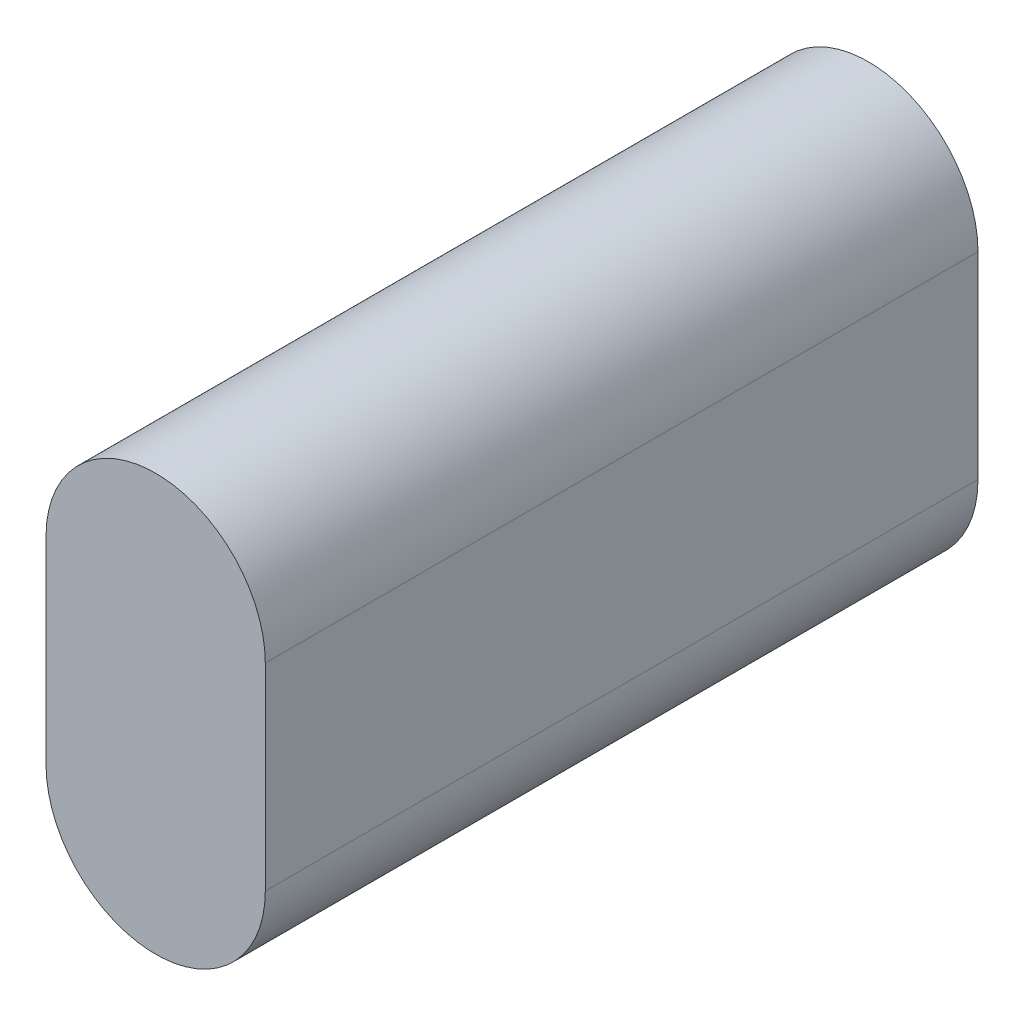
ISO-10303-21;
HEADER;
FILE_DESCRIPTION(('STEP AP214'),'2;1');
FILE_NAME('part.step','',(''),(''),'','','');
FILE_SCHEMA(('AUTOMOTIVE_DESIGN { 1 0 10303 214 1 1 1 1 }'));
ENDSEC;
DATA;
#1=APPLICATION_CONTEXT('core data for automotive mechanical design processes');
#2=APPLICATION_PROTOCOL_DEFINITION('international standard','automotive_design',2000,#1);
#3=PRODUCT_CONTEXT('',#1,'mechanical');
#4=PRODUCT('Part','Part','',(#3));
#5=PRODUCT_RELATED_PRODUCT_CATEGORY('part','',(#4));
#6=PRODUCT_DEFINITION_FORMATION('','',#4);
#7=PRODUCT_DEFINITION_CONTEXT('part definition',#1,'design');
#8=PRODUCT_DEFINITION('design','',#6,#7);
#9=PRODUCT_DEFINITION_SHAPE('','',#8);
#10=(LENGTH_UNIT() NAMED_UNIT(*) SI_UNIT(.MILLI.,.METRE.));
#11=(NAMED_UNIT(*) PLANE_ANGLE_UNIT() SI_UNIT($,.RADIAN.));
#12=(NAMED_UNIT(*) SI_UNIT($,.STERADIAN.) SOLID_ANGLE_UNIT());
#13=UNCERTAINTY_MEASURE_WITH_UNIT(LENGTH_MEASURE(1.E-05),#10,'distance_accuracy_value','');
#14=(GEOMETRIC_REPRESENTATION_CONTEXT(3) GLOBAL_UNCERTAINTY_ASSIGNED_CONTEXT((#13)) GLOBAL_UNIT_ASSIGNED_CONTEXT((#10,
#11,#12)) REPRESENTATION_CONTEXT('',''));
#15=CARTESIAN_POINT('',(0.,0.,0.));
#16=DIRECTION('',(0.,0.,1.));
#17=DIRECTION('',(1.,0.,0.));
#18=AXIS2_PLACEMENT_3D('',#15,#16,#17);
#19=CARTESIAN_POINT('',(0.,-9.,65.));
#20=DIRECTION('',(0.,0.,-1.));
#21=DIRECTION('',(-1.,0.,0.));
#22=AXIS2_PLACEMENT_3D('',#19,#20,#21);
#23=CYLINDRICAL_SURFACE('',#22,10.);
#24=CARTESIAN_POINT('',(0.,-9.,0.));
#25=DIRECTION('',(0.,0.,1.));
#26=DIRECTION('',(1.,0.,0.));
#27=AXIS2_PLACEMENT_3D('',#24,#25,#26);
#28=CIRCLE('',#27,10.);
#29=CARTESIAN_POINT('',(-9.99999999999999,-9.,0.));
#30=VERTEX_POINT('',#29);
#31=CARTESIAN_POINT('',(10.,-9.,0.));
#32=VERTEX_POINT('',#31);
#33=EDGE_CURVE('E107',#30,#32,#28,.T.);
#34=ORIENTED_EDGE('',*,*,#33,.T.);
#35=DIRECTION('',(0.,0.,-1.));
#36=VECTOR('',#35,1.);
#37=CARTESIAN_POINT('',(10.,-9.,65.));
#38=LINE('',#37,#36);
#39=CARTESIAN_POINT('',(10.,-9.,65.));
#40=VERTEX_POINT('',#39);
#41=EDGE_CURVE('E11',#40,#32,#38,.T.);
#42=ORIENTED_EDGE('',*,*,#41,.F.);
#43=CARTESIAN_POINT('',(0.,-9.,65.));
#44=DIRECTION('',(0.,0.,1.));
#45=DIRECTION('',(1.,0.,0.));
#46=AXIS2_PLACEMENT_3D('',#43,#44,#45);
#47=CIRCLE('',#46,10.);
#48=CARTESIAN_POINT('',(-9.99999999999999,-9.,65.));
#49=VERTEX_POINT('',#48);
#50=EDGE_CURVE('E91',#49,#40,#47,.T.);
#51=ORIENTED_EDGE('',*,*,#50,.F.);
#52=DIRECTION('',(0.,0.,-1.));
#53=VECTOR('',#52,1.);
#54=CARTESIAN_POINT('',(-9.99999999999999,-9.,65.));
#55=LINE('',#54,#53);
#56=EDGE_CURVE('E103',#49,#30,#55,.T.);
#57=ORIENTED_EDGE('',*,*,#56,.T.);
#58=EDGE_LOOP('',(#34,#42,#51,#57));
#59=FACE_BOUND('',#58,.T.);
#60=ADVANCED_FACE('F39',(#59),#23,.T.);
#61=CARTESIAN_POINT('',(10.,9.00000000000001,65.));
#62=DIRECTION('',(-1.,0.,0.));
#63=DIRECTION('',(0.,-1.,0.));
#64=AXIS2_PLACEMENT_3D('',#61,#62,#63);
#65=PLANE('',#64);
#66=DIRECTION('',(0.,1.,0.));
#67=VECTOR('',#66,1.);
#68=CARTESIAN_POINT('',(10.,9.00000000000001,0.));
#69=LINE('',#68,#67);
#70=CARTESIAN_POINT('',(10.,9.00000000000001,0.));
#71=VERTEX_POINT('',#70);
#72=EDGE_CURVE('E96',#32,#71,#69,.T.);
#73=ORIENTED_EDGE('',*,*,#72,.T.);
#74=DIRECTION('',(0.,0.,-1.));
#75=VECTOR('',#74,1.);
#76=CARTESIAN_POINT('',(10.,9.00000000000001,65.));
#77=LINE('',#76,#75);
#78=CARTESIAN_POINT('',(10.,9.00000000000001,65.));
#79=VERTEX_POINT('',#78);
#80=EDGE_CURVE('E48',#79,#71,#77,.T.);
#81=ORIENTED_EDGE('',*,*,#80,.F.);
#82=DIRECTION('',(0.,1.,0.));
#83=VECTOR('',#82,1.);
#84=CARTESIAN_POINT('',(10.,9.00000000000001,65.));
#85=LINE('',#84,#83);
#86=EDGE_CURVE('E86',#40,#79,#85,.T.);
#87=ORIENTED_EDGE('',*,*,#86,.F.);
#88=ORIENTED_EDGE('',*,*,#41,.T.);
#89=EDGE_LOOP('',(#73,#81,#87,#88));
#90=FACE_BOUND('',#89,.T.);
#91=ADVANCED_FACE('F95',(#90),#65,.F.);
#92=CARTESIAN_POINT('',(0.,9.,65.));
#93=DIRECTION('',(0.,0.,-1.));
#94=DIRECTION('',(-1.,0.,0.));
#95=AXIS2_PLACEMENT_3D('',#92,#93,#94);
#96=CYLINDRICAL_SURFACE('',#95,10.);
#97=CARTESIAN_POINT('',(0.,9.,0.));
#98=DIRECTION('',(0.,0.,1.));
#99=DIRECTION('',(1.,0.,0.));
#100=AXIS2_PLACEMENT_3D('',#97,#98,#99);
#101=CIRCLE('',#100,10.);
#102=CARTESIAN_POINT('',(-9.99999999999999,9.,0.));
#103=VERTEX_POINT('',#102);
#104=EDGE_CURVE('E73',#71,#103,#101,.T.);
#105=ORIENTED_EDGE('',*,*,#104,.T.);
#106=DIRECTION('',(0.,0.,-1.));
#107=VECTOR('',#106,1.);
#108=CARTESIAN_POINT('',(-9.99999999999999,9.,65.));
#109=LINE('',#108,#107);
#110=CARTESIAN_POINT('',(-9.99999999999999,9.,65.));
#111=VERTEX_POINT('',#110);
#112=EDGE_CURVE('E98',#111,#103,#109,.T.);
#113=ORIENTED_EDGE('',*,*,#112,.F.);
#114=CARTESIAN_POINT('',(0.,9.,65.));
#115=DIRECTION('',(0.,0.,1.));
#116=DIRECTION('',(1.,0.,0.));
#117=AXIS2_PLACEMENT_3D('',#114,#115,#116);
#118=CIRCLE('',#117,10.);
#119=EDGE_CURVE('E89',#79,#111,#118,.T.);
#120=ORIENTED_EDGE('',*,*,#119,.F.);
#121=ORIENTED_EDGE('',*,*,#80,.T.);
#122=EDGE_LOOP('',(#105,#113,#120,#121));
#123=FACE_BOUND('',#122,.T.);
#124=ADVANCED_FACE('F99',(#123),#96,.T.);
#125=CARTESIAN_POINT('',(-9.99999999999999,-9.,65.));
#126=DIRECTION('',(1.,0.,0.));
#127=DIRECTION('',(0.,0.,-1.));
#128=AXIS2_PLACEMENT_3D('',#125,#126,#127);
#129=PLANE('',#128);
#130=DIRECTION('',(0.,-1.,0.));
#131=VECTOR('',#130,1.);
#132=CARTESIAN_POINT('',(-9.99999999999999,-9.,0.));
#133=LINE('',#132,#131);
#134=EDGE_CURVE('E79',#103,#30,#133,.T.);
#135=ORIENTED_EDGE('',*,*,#134,.T.);
#136=ORIENTED_EDGE('',*,*,#56,.F.);
#137=DIRECTION('',(0.,-1.,0.));
#138=VECTOR('',#137,1.);
#139=CARTESIAN_POINT('',(-9.99999999999999,-9.,65.));
#140=LINE('',#139,#138);
#141=EDGE_CURVE('E56',#111,#49,#140,.T.);
#142=ORIENTED_EDGE('',*,*,#141,.F.);
#143=ORIENTED_EDGE('',*,*,#112,.T.);
#144=EDGE_LOOP('',(#135,#136,#142,#143));
#145=FACE_BOUND('',#144,.T.);
#146=ADVANCED_FACE('F120',(#145),#129,.F.);
#147=CARTESIAN_POINT('',(0.,-9.,65.));
#148=DIRECTION('',(0.,0.,1.));
#149=DIRECTION('',(1.,0.,0.));
#150=AXIS2_PLACEMENT_3D('',#147,#148,#149);
#151=PLANE('',#150);
#152=ORIENTED_EDGE('',*,*,#50,.T.);
#153=ORIENTED_EDGE('',*,*,#86,.T.);
#154=ORIENTED_EDGE('',*,*,#119,.T.);
#155=ORIENTED_EDGE('',*,*,#141,.T.);
#156=EDGE_LOOP('',(#152,#153,#154,#155));
#157=FACE_BOUND('',#156,.T.);
#158=ADVANCED_FACE('F87',(#157),#151,.T.);
#159=CARTESIAN_POINT('',(0.,-9.,0.));
#160=DIRECTION('',(0.,0.,1.));
#161=DIRECTION('',(1.,0.,0.));
#162=AXIS2_PLACEMENT_3D('',#159,#160,#161);
#163=PLANE('',#162);
#164=ORIENTED_EDGE('',*,*,#33,.F.);
#165=ORIENTED_EDGE('',*,*,#134,.F.);
#166=ORIENTED_EDGE('',*,*,#104,.F.);
#167=ORIENTED_EDGE('',*,*,#72,.F.);
#168=EDGE_LOOP('',(#164,#165,#166,#167));
#169=FACE_BOUND('',#168,.T.);
#170=ADVANCED_FACE('F123',(#169),#163,.F.);
#171=CLOSED_SHELL('',(#60,#91,#124,#146,#158,#170));
#172=MANIFOLD_SOLID_BREP('B2',#171);
#173=ADVANCED_BREP_SHAPE_REPRESENTATION('',(#18,#172),#14);
#174=SHAPE_DEFINITION_REPRESENTATION(#9,#173);
ENDSEC;
END-ISO-10303-21;
